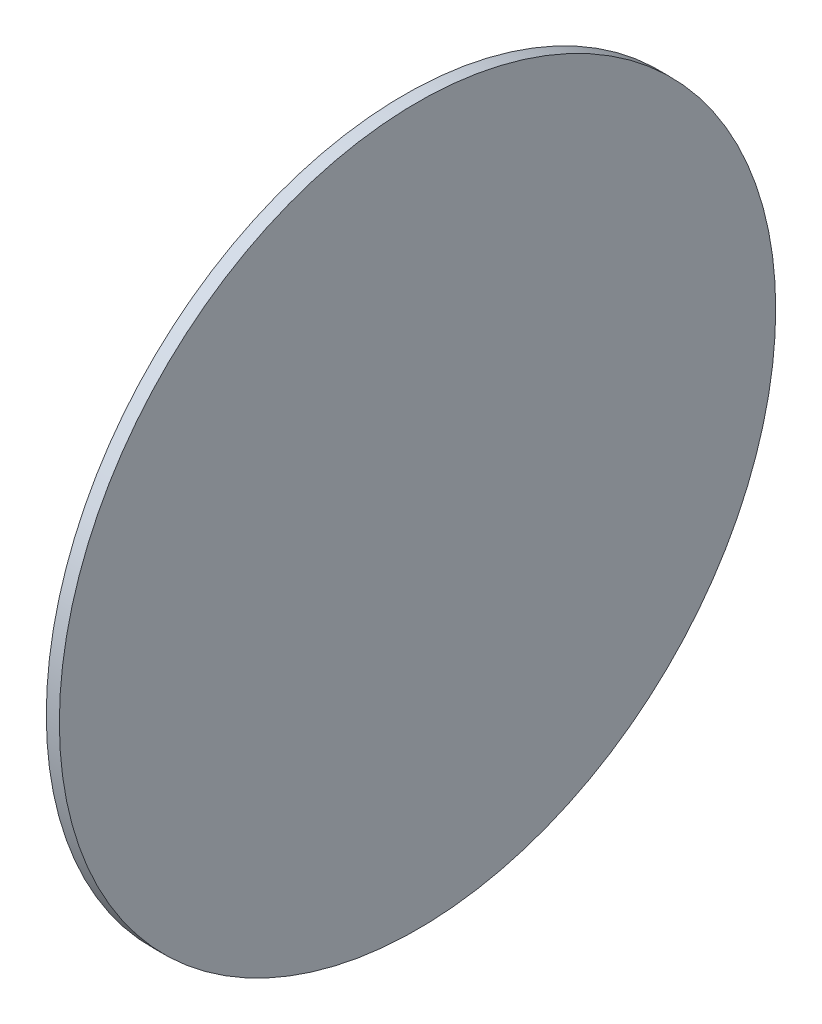
ISO-10303-21;
HEADER;
FILE_DESCRIPTION(('STEP AP214'),'2;1');
FILE_NAME('part.step','',(''),(''),'','','');
FILE_SCHEMA(('AUTOMOTIVE_DESIGN { 1 0 10303 214 1 1 1 1 }'));
ENDSEC;
DATA;
#1=APPLICATION_CONTEXT('core data for automotive mechanical design processes');
#2=APPLICATION_PROTOCOL_DEFINITION('international standard','automotive_design',2000,#1);
#3=PRODUCT_CONTEXT('',#1,'mechanical');
#4=PRODUCT('Part','Part','',(#3));
#5=PRODUCT_RELATED_PRODUCT_CATEGORY('part','',(#4));
#6=PRODUCT_DEFINITION_FORMATION('','',#4);
#7=PRODUCT_DEFINITION_CONTEXT('part definition',#1,'design');
#8=PRODUCT_DEFINITION('design','',#6,#7);
#9=PRODUCT_DEFINITION_SHAPE('','',#8);
#10=(LENGTH_UNIT() NAMED_UNIT(*) SI_UNIT(.MILLI.,.METRE.));
#11=(NAMED_UNIT(*) PLANE_ANGLE_UNIT() SI_UNIT($,.RADIAN.));
#12=(NAMED_UNIT(*) SI_UNIT($,.STERADIAN.) SOLID_ANGLE_UNIT());
#13=UNCERTAINTY_MEASURE_WITH_UNIT(LENGTH_MEASURE(1.E-05),#10,'distance_accuracy_value','');
#14=(GEOMETRIC_REPRESENTATION_CONTEXT(3) GLOBAL_UNCERTAINTY_ASSIGNED_CONTEXT((#13)) GLOBAL_UNIT_ASSIGNED_CONTEXT((#10,
#11,#12)) REPRESENTATION_CONTEXT('',''));
#15=CARTESIAN_POINT('',(0.,0.,0.));
#16=DIRECTION('',(0.,0.,1.));
#17=DIRECTION('',(1.,0.,0.));
#18=AXIS2_PLACEMENT_3D('',#15,#16,#17);
#19=CARTESIAN_POINT('',(4.75,0.,0.));
#20=DIRECTION('',(-1.,0.,0.));
#21=DIRECTION('',(0.,0.,1.));
#22=AXIS2_PLACEMENT_3D('',#19,#20,#21);
#23=CYLINDRICAL_SURFACE('',#22,130.175);
#24=CARTESIAN_POINT('',(4.75,0.,0.));
#25=DIRECTION('',(1.,0.,0.));
#26=DIRECTION('',(0.,0.,-1.));
#27=AXIS2_PLACEMENT_3D('',#24,#25,#26);
#28=CIRCLE('',#27,130.175);
#29=CARTESIAN_POINT('',(4.75,0.,-130.175));
#30=VERTEX_POINT('',#29);
#31=EDGE_CURVE('E10',#30,#30,#28,.T.);
#32=ORIENTED_EDGE('',*,*,#31,.F.);
#33=EDGE_LOOP('',(#32));
#34=FACE_BOUND('',#33,.T.);
#35=CARTESIAN_POINT('',(0.,0.,0.));
#36=DIRECTION('',(1.,0.,0.));
#37=DIRECTION('',(0.,0.,-1.));
#38=AXIS2_PLACEMENT_3D('',#35,#36,#37);
#39=CIRCLE('',#38,130.175);
#40=CARTESIAN_POINT('',(0.,0.,-130.175));
#41=VERTEX_POINT('',#40);
#42=EDGE_CURVE('E43',#41,#41,#39,.T.);
#43=ORIENTED_EDGE('',*,*,#42,.T.);
#44=EDGE_LOOP('',(#43));
#45=FACE_BOUND('',#44,.T.);
#46=ADVANCED_FACE('F40',(#34,#45),#23,.T.);
#47=CARTESIAN_POINT('',(4.75,0.,0.));
#48=DIRECTION('',(1.,0.,0.));
#49=DIRECTION('',(0.,0.,-1.));
#50=AXIS2_PLACEMENT_3D('',#47,#48,#49);
#51=PLANE('',#50);
#52=ORIENTED_EDGE('',*,*,#31,.T.);
#53=EDGE_LOOP('',(#52));
#54=FACE_BOUND('',#53,.T.);
#55=ADVANCED_FACE('F57',(#54),#51,.T.);
#56=CARTESIAN_POINT('',(0.,0.,0.));
#57=DIRECTION('',(1.,0.,0.));
#58=DIRECTION('',(0.,0.,-1.));
#59=AXIS2_PLACEMENT_3D('',#56,#57,#58);
#60=PLANE('',#59);
#61=ORIENTED_EDGE('',*,*,#42,.F.);
#62=EDGE_LOOP('',(#61));
#63=FACE_BOUND('',#62,.T.);
#64=ADVANCED_FACE('F55',(#63),#60,.F.);
#65=CLOSED_SHELL('',(#46,#55,#64));
#66=MANIFOLD_SOLID_BREP('B2',#65);
#67=ADVANCED_BREP_SHAPE_REPRESENTATION('',(#18,#66),#14);
#68=SHAPE_DEFINITION_REPRESENTATION(#9,#67);
ENDSEC;
END-ISO-10303-21;
